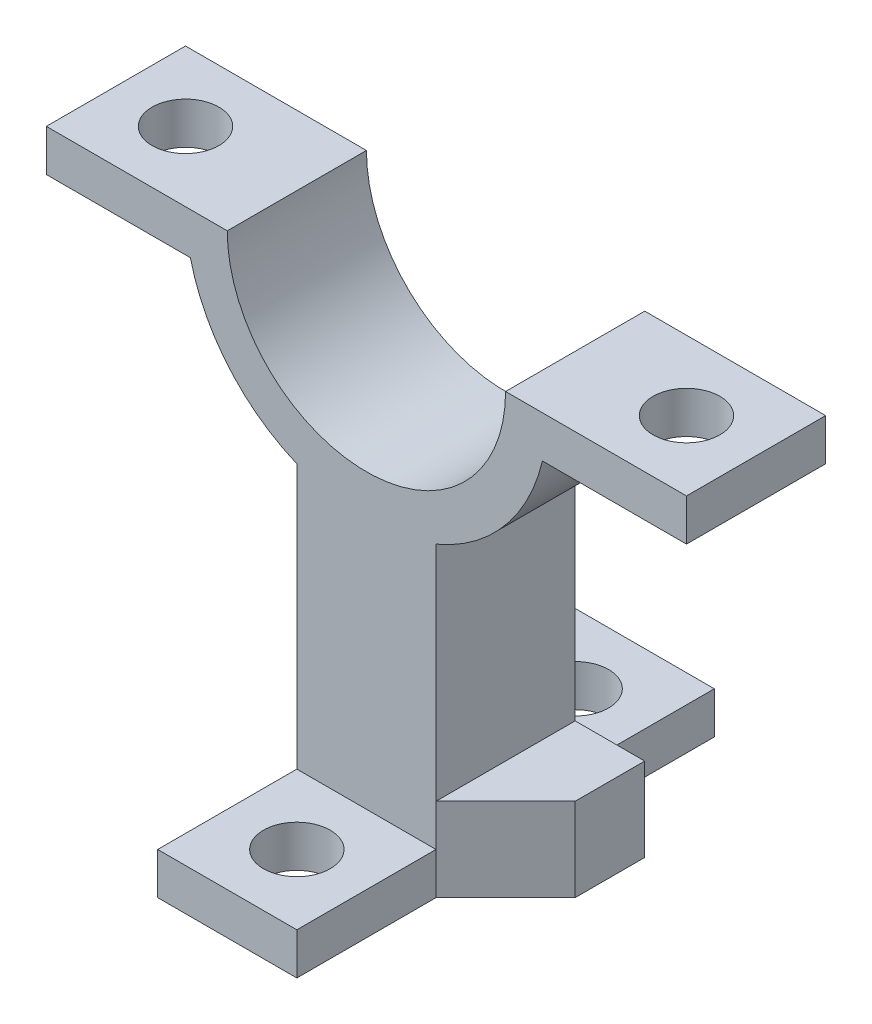
ISO-10303-21;
HEADER;
FILE_DESCRIPTION(('STEP AP214'),'2;1');
FILE_NAME('part.step','',(''),(''),'','','');
FILE_SCHEMA(('AUTOMOTIVE_DESIGN { 1 0 10303 214 1 1 1 1 }'));
ENDSEC;
DATA;
#1=APPLICATION_CONTEXT('core data for automotive mechanical design processes');
#2=APPLICATION_PROTOCOL_DEFINITION('international standard','automotive_design',2000,#1);
#3=PRODUCT_CONTEXT('',#1,'mechanical');
#4=PRODUCT('Part','Part','',(#3));
#5=PRODUCT_RELATED_PRODUCT_CATEGORY('part','',(#4));
#6=PRODUCT_DEFINITION_FORMATION('','',#4);
#7=PRODUCT_DEFINITION_CONTEXT('part definition',#1,'design');
#8=PRODUCT_DEFINITION('design','',#6,#7);
#9=PRODUCT_DEFINITION_SHAPE('','',#8);
#10=(LENGTH_UNIT() NAMED_UNIT(*) SI_UNIT(.MILLI.,.METRE.));
#11=(NAMED_UNIT(*) PLANE_ANGLE_UNIT() SI_UNIT($,.RADIAN.));
#12=(NAMED_UNIT(*) SI_UNIT($,.STERADIAN.) SOLID_ANGLE_UNIT());
#13=UNCERTAINTY_MEASURE_WITH_UNIT(LENGTH_MEASURE(1.E-05),#10,'distance_accuracy_value','');
#14=(GEOMETRIC_REPRESENTATION_CONTEXT(3) GLOBAL_UNCERTAINTY_ASSIGNED_CONTEXT((#13)) GLOBAL_UNIT_ASSIGNED_CONTEXT((#10,
#11,#12)) REPRESENTATION_CONTEXT('',''));
#15=CARTESIAN_POINT('',(0.,0.,0.));
#16=DIRECTION('',(0.,0.,1.));
#17=DIRECTION('',(1.,0.,0.));
#18=AXIS2_PLACEMENT_3D('',#15,#16,#17);
#19=CARTESIAN_POINT('',(-4.99999999999996,-4.15331193145908,2.5));
#20=DIRECTION('',(1.,0.,0.));
#21=DIRECTION('',(0.,1.,0.));
#22=AXIS2_PLACEMENT_3D('',#19,#20,#21);
#23=PLANE('',#22);
#24=DIRECTION('',(0.,0.,-1.));
#25=VECTOR('',#24,1.);
#26=CARTESIAN_POINT('',(-4.99999999999994,-14.,7.5));
#27=LINE('',#26,#25);
#28=CARTESIAN_POINT('',(-4.99999999999994,-14.,0.));
#29=VERTEX_POINT('',#28);
#30=CARTESIAN_POINT('',(-4.99999999999994,-14.,-2.5));
#31=VERTEX_POINT('',#30);
#32=EDGE_CURVE('E491',#29,#31,#27,.T.);
#33=ORIENTED_EDGE('',*,*,#32,.T.);
#34=DIRECTION('',(0.,-1.,0.));
#35=VECTOR('',#34,1.);
#36=CARTESIAN_POINT('',(-4.99999999999996,-4.15331193145908,-2.5));
#37=LINE('',#36,#35);
#38=CARTESIAN_POINT('',(-5.,-17.,-2.5));
#39=VERTEX_POINT('',#38);
#40=EDGE_CURVE('E379',#31,#39,#37,.T.);
#41=ORIENTED_EDGE('',*,*,#40,.T.);
#42=DIRECTION('',(0.,0.,-1.));
#43=VECTOR('',#42,1.);
#44=CARTESIAN_POINT('',(-5.,-17.,2.5));
#45=LINE('',#44,#43);
#46=CARTESIAN_POINT('',(-4.99999999999994,-17.,0.));
#47=VERTEX_POINT('',#46);
#48=EDGE_CURVE('E418',#47,#39,#45,.T.);
#49=ORIENTED_EDGE('',*,*,#48,.F.);
#50=DIRECTION('',(0.,-1.,0.));
#51=VECTOR('',#50,1.);
#52=CARTESIAN_POINT('',(-5.00000000000001,0.00100000000002876,0.));
#53=LINE('',#52,#51);
#54=EDGE_CURVE('E228',#29,#47,#53,.T.);
#55=ORIENTED_EDGE('',*,*,#54,.F.);
#56=EDGE_LOOP('',(#33,#41,#49,#55));
#57=FACE_BOUND('',#56,.T.);
#58=ADVANCED_FACE('F39',(#57),#23,.F.);
#59=CARTESIAN_POINT('',(5.,-4.15331193145904,2.5));
#60=DIRECTION('',(-1.,0.,0.));
#61=DIRECTION('',(0.,-1.,0.));
#62=AXIS2_PLACEMENT_3D('',#59,#60,#61);
#63=PLANE('',#62);
#64=DIRECTION('',(0.,0.,-1.));
#65=VECTOR('',#64,1.);
#66=CARTESIAN_POINT('',(4.99999999999994,-14.,7.5));
#67=LINE('',#66,#65);
#68=CARTESIAN_POINT('',(4.99999999999994,-14.,0.));
#69=VERTEX_POINT('',#68);
#70=CARTESIAN_POINT('',(4.99999999999994,-14.,-2.5));
#71=VERTEX_POINT('',#70);
#72=EDGE_CURVE('E201',#69,#71,#67,.T.);
#73=ORIENTED_EDGE('',*,*,#72,.F.);
#74=DIRECTION('',(0.,-1.,0.));
#75=VECTOR('',#74,1.);
#76=CARTESIAN_POINT('',(4.99999999999986,0.00100000000007039,0.));
#77=LINE('',#76,#75);
#78=CARTESIAN_POINT('',(4.99999999999994,-17.,0.));
#79=VERTEX_POINT('',#78);
#80=EDGE_CURVE('E211',#69,#79,#77,.T.);
#81=ORIENTED_EDGE('',*,*,#80,.T.);
#82=DIRECTION('',(0.,0.,-1.));
#83=VECTOR('',#82,1.);
#84=CARTESIAN_POINT('',(5.,-17.,2.5));
#85=LINE('',#84,#83);
#86=CARTESIAN_POINT('',(5.,-17.,-2.5));
#87=VERTEX_POINT('',#86);
#88=EDGE_CURVE('E415',#79,#87,#85,.T.);
#89=ORIENTED_EDGE('',*,*,#88,.T.);
#90=DIRECTION('',(0.,1.,0.));
#91=VECTOR('',#90,1.);
#92=CARTESIAN_POINT('',(5.,-4.15331193145904,-2.5));
#93=LINE('',#92,#91);
#94=EDGE_CURVE('E214',#87,#71,#93,.T.);
#95=ORIENTED_EDGE('',*,*,#94,.T.);
#96=EDGE_LOOP('',(#73,#81,#89,#95));
#97=FACE_BOUND('',#96,.T.);
#98=ADVANCED_FACE('F210',(#97),#63,.F.);
#99=CARTESIAN_POINT('',(0.,0.,-2.5));
#100=DIRECTION('',(0.,0.,-1.));
#101=DIRECTION('',(-1.,0.,0.));
#102=AXIS2_PLACEMENT_3D('',#99,#100,#101);
#103=PLANE('',#102);
#104=DIRECTION('',(0.,1.,0.));
#105=VECTOR('',#104,1.);
#106=CARTESIAN_POINT('',(-2.50000000000007,0.,-2.5));
#107=LINE('',#106,#105);
#108=CARTESIAN_POINT('',(-2.50000000000001,-14.,-2.5));
#109=VERTEX_POINT('',#108);
#110=CARTESIAN_POINT('',(-2.50000000000005,-5.99999999999998,-2.5));
#111=VERTEX_POINT('',#110);
#112=EDGE_CURVE('E565',#109,#111,#107,.T.);
#113=ORIENTED_EDGE('',*,*,#112,.T.);
#114=CARTESIAN_POINT('',(0.,0.,-2.5));
#115=DIRECTION('',(0.,0.,1.));
#116=DIRECTION('',(-1.,0.,0.));
#117=AXIS2_PLACEMENT_3D('',#114,#115,#116);
#118=CIRCLE('',#117,6.5);
#119=CARTESIAN_POINT('',(-6.32455532033674,-1.50000000000006,-2.5));
#120=VERTEX_POINT('',#119);
#121=EDGE_CURVE('E376',#120,#111,#118,.T.);
#122=ORIENTED_EDGE('',*,*,#121,.F.);
#123=DIRECTION('',(1.,0.,0.));
#124=VECTOR('',#123,1.);
#125=CARTESIAN_POINT('',(-11.5,-1.5000000000001,-2.5));
#126=LINE('',#125,#124);
#127=CARTESIAN_POINT('',(-11.5,-1.5000000000001,-2.5));
#128=VERTEX_POINT('',#127);
#129=EDGE_CURVE('E373',#128,#120,#126,.T.);
#130=ORIENTED_EDGE('',*,*,#129,.F.);
#131=DIRECTION('',(0.,-1.,0.));
#132=VECTOR('',#131,1.);
#133=CARTESIAN_POINT('',(-11.5,-1.03464805829096E-13,-2.5));
#134=LINE('',#133,#132);
#135=CARTESIAN_POINT('',(-11.5,-1.03464805829096E-13,-2.5));
#136=VERTEX_POINT('',#135);
#137=EDGE_CURVE('E370',#136,#128,#134,.T.);
#138=ORIENTED_EDGE('',*,*,#137,.F.);
#139=DIRECTION('',(-1.,0.,0.));
#140=VECTOR('',#139,1.);
#141=CARTESIAN_POINT('',(-5.,0.,-2.5));
#142=LINE('',#141,#140);
#143=CARTESIAN_POINT('',(-5.,0.,-2.5));
#144=VERTEX_POINT('',#143);
#145=EDGE_CURVE('E367',#144,#136,#142,.T.);
#146=ORIENTED_EDGE('',*,*,#145,.F.);
#147=CARTESIAN_POINT('',(0.,0.,-2.5));
#148=DIRECTION('',(0.,0.,-1.));
#149=DIRECTION('',(-1.,0.,0.));
#150=AXIS2_PLACEMENT_3D('',#147,#148,#149);
#151=CIRCLE('',#150,5.);
#152=CARTESIAN_POINT('',(5.,0.,-2.5));
#153=VERTEX_POINT('',#152);
#154=EDGE_CURVE('E363',#153,#144,#151,.T.);
#155=ORIENTED_EDGE('',*,*,#154,.F.);
#156=DIRECTION('',(-1.,0.,0.));
#157=VECTOR('',#156,1.);
#158=CARTESIAN_POINT('',(5.,0.,-2.5));
#159=LINE('',#158,#157);
#160=CARTESIAN_POINT('',(11.5,0.,-2.5));
#161=VERTEX_POINT('',#160);
#162=EDGE_CURVE('E338',#161,#153,#159,.T.);
#163=ORIENTED_EDGE('',*,*,#162,.F.);
#164=DIRECTION('',(0.,1.,0.));
#165=VECTOR('',#164,1.);
#166=CARTESIAN_POINT('',(11.5,0.,-2.5));
#167=LINE('',#166,#165);
#168=CARTESIAN_POINT('',(11.5,-1.5,-2.5));
#169=VERTEX_POINT('',#168);
#170=EDGE_CURVE('E395',#169,#161,#167,.T.);
#171=ORIENTED_EDGE('',*,*,#170,.F.);
#172=DIRECTION('',(1.,0.,0.));
#173=VECTOR('',#172,1.);
#174=CARTESIAN_POINT('',(11.5,-1.5,-2.5));
#175=LINE('',#174,#173);
#176=CARTESIAN_POINT('',(6.32455532033676,-1.5,-2.5));
#177=VERTEX_POINT('',#176);
#178=EDGE_CURVE('E392',#177,#169,#175,.T.);
#179=ORIENTED_EDGE('',*,*,#178,.F.);
#180=CARTESIAN_POINT('',(0.,0.,-2.5));
#181=DIRECTION('',(0.,0.,1.));
#182=DIRECTION('',(1.,0.,0.));
#183=AXIS2_PLACEMENT_3D('',#180,#181,#182);
#184=CIRCLE('',#183,6.5);
#185=CARTESIAN_POINT('',(2.49999999999995,-6.00000000000002,-2.5));
#186=VERTEX_POINT('',#185);
#187=EDGE_CURVE('E389',#186,#177,#184,.T.);
#188=ORIENTED_EDGE('',*,*,#187,.F.);
#189=DIRECTION('',(0.,-1.,0.));
#190=VECTOR('',#189,1.);
#191=CARTESIAN_POINT('',(2.49999999999992,0.,-2.5));
#192=LINE('',#191,#190);
#193=CARTESIAN_POINT('',(2.49999999999999,-14.,-2.5));
#194=VERTEX_POINT('',#193);
#195=EDGE_CURVE('E570',#186,#194,#192,.T.);
#196=ORIENTED_EDGE('',*,*,#195,.T.);
#197=DIRECTION('',(1.,0.,0.));
#198=VECTOR('',#197,1.);
#199=CARTESIAN_POINT('',(0.,-14.,-2.5));
#200=LINE('',#199,#198);
#201=EDGE_CURVE('E575',#194,#71,#200,.T.);
#202=ORIENTED_EDGE('',*,*,#201,.T.);
#203=ORIENTED_EDGE('',*,*,#94,.F.);
#204=DIRECTION('',(1.,0.,0.));
#205=VECTOR('',#204,1.);
#206=CARTESIAN_POINT('',(5.,-17.,-2.5));
#207=LINE('',#206,#205);
#208=CARTESIAN_POINT('',(2.5,-17.,-2.5));
#209=VERTEX_POINT('',#208);
#210=EDGE_CURVE('E382',#209,#87,#207,.T.);
#211=ORIENTED_EDGE('',*,*,#210,.F.);
#212=DIRECTION('',(0.,-1.,0.));
#213=VECTOR('',#212,1.);
#214=CARTESIAN_POINT('',(2.49999999999993,0.,-2.5));
#215=LINE('',#214,#213);
#216=CARTESIAN_POINT('',(2.49999999999999,-15.5,-2.5));
#217=VERTEX_POINT('',#216);
#218=EDGE_CURVE('E207',#217,#209,#215,.T.);
#219=ORIENTED_EDGE('',*,*,#218,.F.);
#220=DIRECTION('',(1.,0.,0.));
#221=VECTOR('',#220,1.);
#222=CARTESIAN_POINT('',(0.,-15.5,-2.5));
#223=LINE('',#222,#221);
#224=CARTESIAN_POINT('',(-2.50000000000001,-15.5,-2.5));
#225=VERTEX_POINT('',#224);
#226=EDGE_CURVE('E438',#225,#217,#223,.T.);
#227=ORIENTED_EDGE('',*,*,#226,.F.);
#228=DIRECTION('',(0.,1.,0.));
#229=VECTOR('',#228,1.);
#230=CARTESIAN_POINT('',(-2.50000000000007,0.,-2.5));
#231=LINE('',#230,#229);
#232=CARTESIAN_POINT('',(-2.5,-17.,-2.5));
#233=VERTEX_POINT('',#232);
#234=EDGE_CURVE('E444',#233,#225,#231,.T.);
#235=ORIENTED_EDGE('',*,*,#234,.F.);
#236=EDGE_CURVE('E383',#39,#233,#207,.T.);
#237=ORIENTED_EDGE('',*,*,#236,.F.);
#238=ORIENTED_EDGE('',*,*,#40,.F.);
#239=DIRECTION('',(1.,0.,0.));
#240=VECTOR('',#239,1.);
#241=CARTESIAN_POINT('',(0.,-14.,-2.5));
#242=LINE('',#241,#240);
#243=EDGE_CURVE('E238',#31,#109,#242,.T.);
#244=ORIENTED_EDGE('',*,*,#243,.T.);
#245=EDGE_LOOP('',(#113,#122,#130,#138,#146,#155,#163,#171,#179,#188,#196,#202,#203,#211,#219,
#227,#235,#237,#238,#244));
#246=FACE_BOUND('',#245,.T.);
#247=ADVANCED_FACE('F459',(#246),#103,.T.);
#248=CARTESIAN_POINT('',(-2.50000000000007,0.00100000000003916,2.5));
#249=DIRECTION('',(0.707106781186548,0.,-0.707106781186547));
#250=DIRECTION('',(-0.707106781186547,0.,-0.707106781186548));
#251=AXIS2_PLACEMENT_3D('',#248,#249,#250);
#252=PLANE('',#251);
#253=DIRECTION('',(0.707106781186547,0.,0.707106781186548));
#254=VECTOR('',#253,1.);
#255=CARTESIAN_POINT('',(-2.50000000000004,-14.,2.49999999999997));
#256=LINE('',#255,#254);
#257=CARTESIAN_POINT('',(-2.50000000000001,-14.,2.5));
#258=VERTEX_POINT('',#257);
#259=EDGE_CURVE('E11',#29,#258,#256,.T.);
#260=ORIENTED_EDGE('',*,*,#259,.F.);
#261=ORIENTED_EDGE('',*,*,#54,.T.);
#262=DIRECTION('',(0.707106781186547,0.,0.707106781186548));
#263=VECTOR('',#262,1.);
#264=CARTESIAN_POINT('',(-2.5,-17.,2.5));
#265=LINE('',#264,#263);
#266=CARTESIAN_POINT('',(-2.5,-17.,2.5));
#267=VERTEX_POINT('',#266);
#268=EDGE_CURVE('E234',#47,#267,#265,.T.);
#269=ORIENTED_EDGE('',*,*,#268,.T.);
#270=DIRECTION('',(0.,1.,0.));
#271=VECTOR('',#270,1.);
#272=CARTESIAN_POINT('',(-2.50000000000007,0.,2.5));
#273=LINE('',#272,#271);
#274=CARTESIAN_POINT('',(-2.50000000000001,-15.5,2.5));
#275=VERTEX_POINT('',#274);
#276=EDGE_CURVE('E313',#267,#275,#273,.T.);
#277=ORIENTED_EDGE('',*,*,#276,.T.);
#278=DIRECTION('',(0.,-1.,0.));
#279=VECTOR('',#278,1.);
#280=CARTESIAN_POINT('',(-2.50000000000007,0.00100000000003916,2.5));
#281=LINE('',#280,#279);
#282=EDGE_CURVE('E237',#258,#275,#281,.T.);
#283=ORIENTED_EDGE('',*,*,#282,.F.);
#284=EDGE_LOOP('',(#260,#261,#269,#277,#283));
#285=FACE_BOUND('',#284,.T.);
#286=ADVANCED_FACE('F592',(#285),#252,.F.);
#287=CARTESIAN_POINT('',(2.49999999999993,0.00100000000005998,2.5));
#288=DIRECTION('',(-0.707106781186548,0.,-0.707106781186547));
#289=DIRECTION('',(-0.707106781186547,0.,0.707106781186548));
#290=AXIS2_PLACEMENT_3D('',#287,#288,#289);
#291=PLANE('',#290);
#292=DIRECTION('',(0.707106781186547,0.,-0.707106781186548));
#293=VECTOR('',#292,1.);
#294=CARTESIAN_POINT('',(2.49999999999996,-14.,2.50000000000003));
#295=LINE('',#294,#293);
#296=CARTESIAN_POINT('',(2.49999999999999,-14.,2.5));
#297=VERTEX_POINT('',#296);
#298=EDGE_CURVE('E48',#297,#69,#295,.T.);
#299=ORIENTED_EDGE('',*,*,#298,.F.);
#300=DIRECTION('',(0.,-1.,0.));
#301=VECTOR('',#300,1.);
#302=CARTESIAN_POINT('',(2.49999999999993,0.00100000000005998,2.5));
#303=LINE('',#302,#301);
#304=CARTESIAN_POINT('',(2.49999999999999,-15.5,2.5));
#305=VERTEX_POINT('',#304);
#306=EDGE_CURVE('E222',#297,#305,#303,.T.);
#307=ORIENTED_EDGE('',*,*,#306,.T.);
#308=DIRECTION('',(0.,-1.,0.));
#309=VECTOR('',#308,1.);
#310=CARTESIAN_POINT('',(2.49999999999993,0.,2.5));
#311=LINE('',#310,#309);
#312=CARTESIAN_POINT('',(2.5,-17.,2.5));
#313=VERTEX_POINT('',#312);
#314=EDGE_CURVE('E317',#305,#313,#311,.T.);
#315=ORIENTED_EDGE('',*,*,#314,.T.);
#316=DIRECTION('',(0.707106781186547,0.,-0.707106781186548));
#317=VECTOR('',#316,1.);
#318=CARTESIAN_POINT('',(2.5,-17.,2.5));
#319=LINE('',#318,#317);
#320=EDGE_CURVE('E219',#313,#79,#319,.T.);
#321=ORIENTED_EDGE('',*,*,#320,.T.);
#322=ORIENTED_EDGE('',*,*,#80,.F.);
#323=EDGE_LOOP('',(#299,#307,#315,#321,#322));
#324=FACE_BOUND('',#323,.T.);
#325=ADVANCED_FACE('F217',(#324),#291,.F.);
#326=CARTESIAN_POINT('',(0.,0.,2.5));
#327=DIRECTION('',(0.,0.,-1.));
#328=DIRECTION('',(-1.,0.,0.));
#329=AXIS2_PLACEMENT_3D('',#326,#327,#328);
#330=CYLINDRICAL_SURFACE('',#329,5.);
#331=ORIENTED_EDGE('',*,*,#154,.T.);
#332=DIRECTION('',(0.,0.,-1.));
#333=VECTOR('',#332,1.);
#334=CARTESIAN_POINT('',(-5.,0.,2.5));
#335=LINE('',#334,#333);
#336=CARTESIAN_POINT('',(-5.,0.,2.5));
#337=VERTEX_POINT('',#336);
#338=EDGE_CURVE('E434',#337,#144,#335,.T.);
#339=ORIENTED_EDGE('',*,*,#338,.F.);
#340=CARTESIAN_POINT('',(0.,0.,2.5));
#341=DIRECTION('',(0.,0.,-1.));
#342=DIRECTION('',(-1.,0.,0.));
#343=AXIS2_PLACEMENT_3D('',#340,#341,#342);
#344=CIRCLE('',#343,5.);
#345=CARTESIAN_POINT('',(5.,0.,2.5));
#346=VERTEX_POINT('',#345);
#347=EDGE_CURVE('E333',#346,#337,#344,.T.);
#348=ORIENTED_EDGE('',*,*,#347,.F.);
#349=DIRECTION('',(0.,0.,-1.));
#350=VECTOR('',#349,1.);
#351=CARTESIAN_POINT('',(5.,0.,2.5));
#352=LINE('',#351,#350);
#353=EDGE_CURVE('E362',#346,#153,#352,.T.);
#354=ORIENTED_EDGE('',*,*,#353,.T.);
#355=EDGE_LOOP('',(#331,#339,#348,#354));
#356=FACE_BOUND('',#355,.T.);
#357=ADVANCED_FACE('F41',(#356),#330,.F.);
#358=CARTESIAN_POINT('',(-5.,0.,2.5));
#359=DIRECTION('',(0.,-1.,0.));
#360=DIRECTION('',(1.,0.,0.));
#361=AXIS2_PLACEMENT_3D('',#358,#359,#360);
#362=PLANE('',#361);
#363=CARTESIAN_POINT('',(-9.,0.,0.));
#364=DIRECTION('',(0.,1.,0.));
#365=DIRECTION('',(0.,0.,1.));
#366=AXIS2_PLACEMENT_3D('',#363,#364,#365);
#367=CIRCLE('',#366,1.2);
#368=CARTESIAN_POINT('',(-9.,0.,1.2));
#369=VERTEX_POINT('',#368);
#370=EDGE_CURVE('E321',#369,#369,#367,.T.);
#371=ORIENTED_EDGE('',*,*,#370,.F.);
#372=EDGE_LOOP('',(#371));
#373=FACE_BOUND('',#372,.T.);
#374=ORIENTED_EDGE('',*,*,#145,.T.);
#375=DIRECTION('',(0.,0.,-1.));
#376=VECTOR('',#375,1.);
#377=CARTESIAN_POINT('',(-11.5,-1.03464805829096E-13,2.5));
#378=LINE('',#377,#376);
#379=CARTESIAN_POINT('',(-11.5,-1.03464805829096E-13,2.5));
#380=VERTEX_POINT('',#379);
#381=EDGE_CURVE('E430',#380,#136,#378,.T.);
#382=ORIENTED_EDGE('',*,*,#381,.F.);
#383=DIRECTION('',(-1.,0.,0.));
#384=VECTOR('',#383,1.);
#385=CARTESIAN_POINT('',(-5.,0.,2.5));
#386=LINE('',#385,#384);
#387=EDGE_CURVE('E337',#337,#380,#386,.T.);
#388=ORIENTED_EDGE('',*,*,#387,.F.);
#389=ORIENTED_EDGE('',*,*,#338,.T.);
#390=EDGE_LOOP('',(#374,#382,#388,#389));
#391=FACE_BOUND('',#390,.T.);
#392=ADVANCED_FACE('F536',(#373,#391),#362,.F.);
#393=CARTESIAN_POINT('',(-11.5,-1.03464805829096E-13,2.5));
#394=DIRECTION('',(1.,0.,0.));
#395=DIRECTION('',(0.,1.,0.));
#396=AXIS2_PLACEMENT_3D('',#393,#394,#395);
#397=PLANE('',#396);
#398=ORIENTED_EDGE('',*,*,#137,.T.);
#399=DIRECTION('',(0.,0.,-1.));
#400=VECTOR('',#399,1.);
#401=CARTESIAN_POINT('',(-11.5,-1.5000000000001,2.5));
#402=LINE('',#401,#400);
#403=CARTESIAN_POINT('',(-11.5,-1.5000000000001,2.5));
#404=VERTEX_POINT('',#403);
#405=EDGE_CURVE('E426',#404,#128,#402,.T.);
#406=ORIENTED_EDGE('',*,*,#405,.F.);
#407=DIRECTION('',(0.,-1.,0.));
#408=VECTOR('',#407,1.);
#409=CARTESIAN_POINT('',(-11.5,-1.03464805829096E-13,2.5));
#410=LINE('',#409,#408);
#411=EDGE_CURVE('E341',#380,#404,#410,.T.);
#412=ORIENTED_EDGE('',*,*,#411,.F.);
#413=ORIENTED_EDGE('',*,*,#381,.T.);
#414=EDGE_LOOP('',(#398,#406,#412,#413));
#415=FACE_BOUND('',#414,.T.);
#416=ADVANCED_FACE('F533',(#415),#397,.F.);
#417=CARTESIAN_POINT('',(-11.5,-1.5000000000001,2.5));
#418=DIRECTION('',(0.,1.,0.));
#419=DIRECTION('',(-1.,0.,0.));
#420=AXIS2_PLACEMENT_3D('',#417,#418,#419);
#421=PLANE('',#420);
#422=CARTESIAN_POINT('',(-9.,-1.50000000000008,0.));
#423=DIRECTION('',(0.,1.,0.));
#424=DIRECTION('',(-1.,0.,0.));
#425=AXIS2_PLACEMENT_3D('',#422,#423,#424);
#426=CIRCLE('',#425,1.2);
#427=CARTESIAN_POINT('',(-10.2,-1.50000000000009,0.));
#428=VERTEX_POINT('',#427);
#429=EDGE_CURVE('E332',#428,#428,#426,.T.);
#430=ORIENTED_EDGE('',*,*,#429,.T.);
#431=EDGE_LOOP('',(#430));
#432=FACE_BOUND('',#431,.T.);
#433=ORIENTED_EDGE('',*,*,#129,.T.);
#434=DIRECTION('',(0.,0.,-1.));
#435=VECTOR('',#434,1.);
#436=CARTESIAN_POINT('',(-6.32455532033674,-1.50000000000006,2.5));
#437=LINE('',#436,#435);
#438=CARTESIAN_POINT('',(-6.32455532033674,-1.50000000000006,2.5));
#439=VERTEX_POINT('',#438);
#440=EDGE_CURVE('E422',#439,#120,#437,.T.);
#441=ORIENTED_EDGE('',*,*,#440,.F.);
#442=DIRECTION('',(1.,0.,0.));
#443=VECTOR('',#442,1.);
#444=CARTESIAN_POINT('',(-11.5,-1.5000000000001,2.5));
#445=LINE('',#444,#443);
#446=EDGE_CURVE('E344',#404,#439,#445,.T.);
#447=ORIENTED_EDGE('',*,*,#446,.F.);
#448=ORIENTED_EDGE('',*,*,#405,.T.);
#449=EDGE_LOOP('',(#433,#441,#447,#448));
#450=FACE_BOUND('',#449,.T.);
#451=ADVANCED_FACE('F529',(#432,#450),#421,.F.);
#452=CARTESIAN_POINT('',(0.,0.,2.5));
#453=DIRECTION('',(0.,0.,-1.));
#454=DIRECTION('',(-1.,0.,0.));
#455=AXIS2_PLACEMENT_3D('',#452,#453,#454);
#456=CYLINDRICAL_SURFACE('',#455,6.5);
#457=DIRECTION('',(0.,0.,-1.));
#458=VECTOR('',#457,1.);
#459=CARTESIAN_POINT('',(-2.50000000000005,-5.99999999999998,7.5));
#460=LINE('',#459,#458);
#461=CARTESIAN_POINT('',(-2.50000000000005,-5.99999999999998,2.50000000000001));
#462=VERTEX_POINT('',#461);
#463=EDGE_CURVE('E560',#462,#111,#460,.T.);
#464=ORIENTED_EDGE('',*,*,#463,.F.);
#465=CARTESIAN_POINT('',(0.,0.,2.5));
#466=DIRECTION('',(0.,0.,1.));
#467=DIRECTION('',(-1.,0.,0.));
#468=AXIS2_PLACEMENT_3D('',#465,#466,#467);
#469=CIRCLE('',#468,6.5);
#470=EDGE_CURVE('E347',#439,#462,#469,.T.);
#471=ORIENTED_EDGE('',*,*,#470,.F.);
#472=ORIENTED_EDGE('',*,*,#440,.T.);
#473=ORIENTED_EDGE('',*,*,#121,.T.);
#474=EDGE_LOOP('',(#464,#471,#472,#473));
#475=FACE_BOUND('',#474,.T.);
#476=ADVANCED_FACE('F526',(#475),#456,.T.);
#477=CARTESIAN_POINT('',(5.,-17.,2.5));
#478=DIRECTION('',(0.,1.,0.));
#479=DIRECTION('',(0.,0.,1.));
#480=AXIS2_PLACEMENT_3D('',#477,#478,#479);
#481=PLANE('',#480);
#482=ORIENTED_EDGE('',*,*,#88,.F.);
#483=ORIENTED_EDGE('',*,*,#320,.F.);
#484=DIRECTION('',(0.,0.,1.));
#485=VECTOR('',#484,1.);
#486=CARTESIAN_POINT('',(2.5,-17.,-7.5));
#487=LINE('',#486,#485);
#488=CARTESIAN_POINT('',(2.5,-17.,7.5));
#489=VERTEX_POINT('',#488);
#490=EDGE_CURVE('E257',#313,#489,#487,.T.);
#491=ORIENTED_EDGE('',*,*,#490,.T.);
#492=DIRECTION('',(-1.,0.,0.));
#493=VECTOR('',#492,1.);
#494=CARTESIAN_POINT('',(-2.5,-17.,7.5));
#495=LINE('',#494,#493);
#496=CARTESIAN_POINT('',(-2.5,-17.,7.5));
#497=VERTEX_POINT('',#496);
#498=EDGE_CURVE('E283',#489,#497,#495,.T.);
#499=ORIENTED_EDGE('',*,*,#498,.T.);
#500=DIRECTION('',(0.,0.,-1.));
#501=VECTOR('',#500,1.);
#502=CARTESIAN_POINT('',(-2.5,-17.,-7.5));
#503=LINE('',#502,#501);
#504=EDGE_CURVE('E288',#497,#267,#503,.T.);
#505=ORIENTED_EDGE('',*,*,#504,.T.);
#506=ORIENTED_EDGE('',*,*,#268,.F.);
#507=ORIENTED_EDGE('',*,*,#48,.T.);
#508=ORIENTED_EDGE('',*,*,#236,.T.);
#509=CARTESIAN_POINT('',(-2.5,-17.,-7.5));
#510=VERTEX_POINT('',#509);
#511=EDGE_CURVE('E287',#233,#510,#503,.T.);
#512=ORIENTED_EDGE('',*,*,#511,.T.);
#513=DIRECTION('',(1.,0.,0.));
#514=VECTOR('',#513,1.);
#515=CARTESIAN_POINT('',(-2.5,-17.,-7.5));
#516=LINE('',#515,#514);
#517=CARTESIAN_POINT('',(2.5,-17.,-7.5));
#518=VERTEX_POINT('',#517);
#519=EDGE_CURVE('E292',#510,#518,#516,.T.);
#520=ORIENTED_EDGE('',*,*,#519,.T.);
#521=EDGE_CURVE('E280',#518,#209,#487,.T.);
#522=ORIENTED_EDGE('',*,*,#521,.T.);
#523=ORIENTED_EDGE('',*,*,#210,.T.);
#524=EDGE_LOOP('',(#482,#483,#491,#499,#505,#506,#507,#508,#512,#520,#522,#523));
#525=FACE_BOUND('',#524,.T.);
#526=CARTESIAN_POINT('',(0.,-17.,-5.));
#527=DIRECTION('',(0.,-1.,0.));
#528=DIRECTION('',(-1.,0.,0.));
#529=AXIS2_PLACEMENT_3D('',#526,#527,#528);
#530=CIRCLE('',#529,1.2);
#531=CARTESIAN_POINT('',(-1.2,-17.,-5.));
#532=VERTEX_POINT('',#531);
#533=EDGE_CURVE('E233',#532,#532,#530,.T.);
#534=ORIENTED_EDGE('',*,*,#533,.F.);
#535=EDGE_LOOP('',(#534));
#536=FACE_BOUND('',#535,.T.);
#537=CARTESIAN_POINT('',(0.,-17.,5.));
#538=DIRECTION('',(0.,-1.,0.));
#539=DIRECTION('',(1.,0.,0.));
#540=AXIS2_PLACEMENT_3D('',#537,#538,#539);
#541=CIRCLE('',#540,1.2);
#542=CARTESIAN_POINT('',(1.2,-17.,5.));
#543=VERTEX_POINT('',#542);
#544=EDGE_CURVE('E249',#543,#543,#541,.T.);
#545=ORIENTED_EDGE('',*,*,#544,.F.);
#546=EDGE_LOOP('',(#545));
#547=FACE_BOUND('',#546,.T.);
#548=ADVANCED_FACE('F467',(#525,#536,#547),#481,.F.);
#549=CARTESIAN_POINT('',(0.,0.,2.5));
#550=DIRECTION('',(0.,0.,-1.));
#551=DIRECTION('',(-1.,0.,0.));
#552=AXIS2_PLACEMENT_3D('',#549,#550,#551);
#553=CYLINDRICAL_SURFACE('',#552,6.5);
#554=DIRECTION('',(0.,0.,-1.));
#555=VECTOR('',#554,1.);
#556=CARTESIAN_POINT('',(2.49999999999995,-6.00000000000002,7.5));
#557=LINE('',#556,#555);
#558=CARTESIAN_POINT('',(2.49999999999995,-6.00000000000002,2.49999999999999));
#559=VERTEX_POINT('',#558);
#560=EDGE_CURVE('E567',#559,#186,#557,.T.);
#561=ORIENTED_EDGE('',*,*,#560,.T.);
#562=ORIENTED_EDGE('',*,*,#187,.T.);
#563=DIRECTION('',(0.,0.,-1.));
#564=VECTOR('',#563,1.);
#565=CARTESIAN_POINT('',(6.32455532033676,-1.5,2.5));
#566=LINE('',#565,#564);
#567=CARTESIAN_POINT('',(6.32455532033676,-1.5,2.5));
#568=VERTEX_POINT('',#567);
#569=EDGE_CURVE('E411',#568,#177,#566,.T.);
#570=ORIENTED_EDGE('',*,*,#569,.F.);
#571=CARTESIAN_POINT('',(0.,0.,2.5));
#572=DIRECTION('',(0.,0.,1.));
#573=DIRECTION('',(1.,0.,0.));
#574=AXIS2_PLACEMENT_3D('',#571,#572,#573);
#575=CIRCLE('',#574,6.5);
#576=EDGE_CURVE('E350',#559,#568,#575,.T.);
#577=ORIENTED_EDGE('',*,*,#576,.F.);
#578=EDGE_LOOP('',(#561,#562,#570,#577));
#579=FACE_BOUND('',#578,.T.);
#580=ADVANCED_FACE('F602',(#579),#553,.T.);
#581=CARTESIAN_POINT('',(11.5,-1.5,2.5));
#582=DIRECTION('',(0.,1.,0.));
#583=DIRECTION('',(-1.,0.,0.));
#584=AXIS2_PLACEMENT_3D('',#581,#582,#583);
#585=PLANE('',#584);
#586=CARTESIAN_POINT('',(9.,-1.5,0.));
#587=DIRECTION('',(0.,1.,0.));
#588=DIRECTION('',(-1.,0.,0.));
#589=AXIS2_PLACEMENT_3D('',#586,#587,#588);
#590=CIRCLE('',#589,1.2);
#591=CARTESIAN_POINT('',(7.8,-1.5,0.));
#592=VERTEX_POINT('',#591);
#593=EDGE_CURVE('E325',#592,#592,#590,.T.);
#594=ORIENTED_EDGE('',*,*,#593,.T.);
#595=EDGE_LOOP('',(#594));
#596=FACE_BOUND('',#595,.T.);
#597=ORIENTED_EDGE('',*,*,#178,.T.);
#598=DIRECTION('',(0.,0.,-1.));
#599=VECTOR('',#598,1.);
#600=CARTESIAN_POINT('',(11.5,-1.5,2.5));
#601=LINE('',#600,#599);
#602=CARTESIAN_POINT('',(11.5,-1.5,2.5));
#603=VERTEX_POINT('',#602);
#604=EDGE_CURVE('E407',#603,#169,#601,.T.);
#605=ORIENTED_EDGE('',*,*,#604,.F.);
#606=DIRECTION('',(1.,0.,0.));
#607=VECTOR('',#606,1.);
#608=CARTESIAN_POINT('',(11.5,-1.5,2.5));
#609=LINE('',#608,#607);
#610=EDGE_CURVE('E353',#568,#603,#609,.T.);
#611=ORIENTED_EDGE('',*,*,#610,.F.);
#612=ORIENTED_EDGE('',*,*,#569,.T.);
#613=EDGE_LOOP('',(#597,#605,#611,#612));
#614=FACE_BOUND('',#613,.T.);
#615=ADVANCED_FACE('F607',(#596,#614),#585,.F.);
#616=CARTESIAN_POINT('',(11.5,0.,2.5));
#617=DIRECTION('',(-1.,0.,0.));
#618=DIRECTION('',(0.,0.,1.));
#619=AXIS2_PLACEMENT_3D('',#616,#617,#618);
#620=PLANE('',#619);
#621=ORIENTED_EDGE('',*,*,#170,.T.);
#622=DIRECTION('',(0.,0.,-1.));
#623=VECTOR('',#622,1.);
#624=CARTESIAN_POINT('',(11.5,0.,2.5));
#625=LINE('',#624,#623);
#626=CARTESIAN_POINT('',(11.5,0.,2.5));
#627=VERTEX_POINT('',#626);
#628=EDGE_CURVE('E403',#627,#161,#625,.T.);
#629=ORIENTED_EDGE('',*,*,#628,.F.);
#630=DIRECTION('',(0.,1.,0.));
#631=VECTOR('',#630,1.);
#632=CARTESIAN_POINT('',(11.5,0.,2.5));
#633=LINE('',#632,#631);
#634=EDGE_CURVE('E356',#603,#627,#633,.T.);
#635=ORIENTED_EDGE('',*,*,#634,.F.);
#636=ORIENTED_EDGE('',*,*,#604,.T.);
#637=EDGE_LOOP('',(#621,#629,#635,#636));
#638=FACE_BOUND('',#637,.T.);
#639=ADVANCED_FACE('F613',(#638),#620,.F.);
#640=CARTESIAN_POINT('',(5.,0.,2.5));
#641=DIRECTION('',(0.,-1.,0.));
#642=DIRECTION('',(1.,0.,0.));
#643=AXIS2_PLACEMENT_3D('',#640,#641,#642);
#644=PLANE('',#643);
#645=CARTESIAN_POINT('',(9.,0.,0.));
#646=DIRECTION('',(0.,1.,0.));
#647=DIRECTION('',(0.,0.,-1.));
#648=AXIS2_PLACEMENT_3D('',#645,#646,#647);
#649=CIRCLE('',#648,1.2);
#650=CARTESIAN_POINT('',(9.,0.,-1.2));
#651=VERTEX_POINT('',#650);
#652=EDGE_CURVE('E320',#651,#651,#649,.T.);
#653=ORIENTED_EDGE('',*,*,#652,.F.);
#654=EDGE_LOOP('',(#653));
#655=FACE_BOUND('',#654,.T.);
#656=ORIENTED_EDGE('',*,*,#162,.T.);
#657=ORIENTED_EDGE('',*,*,#353,.F.);
#658=DIRECTION('',(-1.,0.,0.));
#659=VECTOR('',#658,1.);
#660=CARTESIAN_POINT('',(5.,0.,2.5));
#661=LINE('',#660,#659);
#662=EDGE_CURVE('E359',#627,#346,#661,.T.);
#663=ORIENTED_EDGE('',*,*,#662,.F.);
#664=ORIENTED_EDGE('',*,*,#628,.T.);
#665=EDGE_LOOP('',(#656,#657,#663,#664));
#666=FACE_BOUND('',#665,.T.);
#667=ADVANCED_FACE('F617',(#655,#666),#644,.F.);
#668=CARTESIAN_POINT('',(0.,0.,2.5));
#669=DIRECTION('',(0.,0.,-1.));
#670=DIRECTION('',(-1.,0.,0.));
#671=AXIS2_PLACEMENT_3D('',#668,#669,#670);
#672=PLANE('',#671);
#673=EDGE_CURVE('E226',#559,#297,#303,.T.);
#674=ORIENTED_EDGE('',*,*,#673,.F.);
#675=ORIENTED_EDGE('',*,*,#576,.T.);
#676=ORIENTED_EDGE('',*,*,#610,.T.);
#677=ORIENTED_EDGE('',*,*,#634,.T.);
#678=ORIENTED_EDGE('',*,*,#662,.T.);
#679=ORIENTED_EDGE('',*,*,#347,.T.);
#680=ORIENTED_EDGE('',*,*,#387,.T.);
#681=ORIENTED_EDGE('',*,*,#411,.T.);
#682=ORIENTED_EDGE('',*,*,#446,.T.);
#683=ORIENTED_EDGE('',*,*,#470,.T.);
#684=EDGE_CURVE('E239',#462,#258,#281,.T.);
#685=ORIENTED_EDGE('',*,*,#684,.T.);
#686=ORIENTED_EDGE('',*,*,#282,.T.);
#687=DIRECTION('',(1.,0.,0.));
#688=VECTOR('',#687,1.);
#689=CARTESIAN_POINT('',(0.,-15.5,2.5));
#690=LINE('',#689,#688);
#691=EDGE_CURVE('E299',#275,#305,#690,.T.);
#692=ORIENTED_EDGE('',*,*,#691,.T.);
#693=ORIENTED_EDGE('',*,*,#306,.F.);
#694=EDGE_LOOP('',(#674,#675,#676,#677,#678,#679,#680,#681,#682,#683,#685,#686,#692,#693));
#695=FACE_BOUND('',#694,.T.);
#696=ADVANCED_FACE('F563',(#695),#672,.F.);
#697=CARTESIAN_POINT('',(9.,-17.,0.));
#698=DIRECTION('',(0.,1.,0.));
#699=DIRECTION('',(0.,0.,1.));
#700=AXIS2_PLACEMENT_3D('',#697,#698,#699);
#701=CYLINDRICAL_SURFACE('',#700,1.2);
#702=ORIENTED_EDGE('',*,*,#652,.T.);
#703=EDGE_LOOP('',(#702));
#704=FACE_BOUND('',#703,.T.);
#705=ORIENTED_EDGE('',*,*,#593,.F.);
#706=EDGE_LOOP('',(#705));
#707=FACE_BOUND('',#706,.T.);
#708=ADVANCED_FACE('F626',(#704,#707),#701,.F.);
#709=CARTESIAN_POINT('',(-9.,-17.,0.));
#710=DIRECTION('',(0.,1.,0.));
#711=DIRECTION('',(0.,0.,1.));
#712=AXIS2_PLACEMENT_3D('',#709,#710,#711);
#713=CYLINDRICAL_SURFACE('',#712,1.2);
#714=ORIENTED_EDGE('',*,*,#370,.T.);
#715=EDGE_LOOP('',(#714));
#716=FACE_BOUND('',#715,.T.);
#717=ORIENTED_EDGE('',*,*,#429,.F.);
#718=EDGE_LOOP('',(#717));
#719=FACE_BOUND('',#718,.T.);
#720=ADVANCED_FACE('F692',(#716,#719),#713,.F.);
#721=CARTESIAN_POINT('',(0.,-15.5,-5.));
#722=DIRECTION('',(0.,-1.,0.));
#723=DIRECTION('',(1.,0.,0.));
#724=AXIS2_PLACEMENT_3D('',#721,#722,#723);
#725=CYLINDRICAL_SURFACE('',#724,1.2);
#726=CARTESIAN_POINT('',(0.,-15.5,-5.));
#727=DIRECTION('',(0.,-1.,0.));
#728=DIRECTION('',(-1.,0.,0.));
#729=AXIS2_PLACEMENT_3D('',#726,#727,#728);
#730=CIRCLE('',#729,1.2);
#731=CARTESIAN_POINT('',(-1.20000000000001,-15.5,-5.));
#732=VERTEX_POINT('',#731);
#733=EDGE_CURVE('E245',#732,#732,#730,.T.);
#734=ORIENTED_EDGE('',*,*,#733,.F.);
#735=EDGE_LOOP('',(#734));
#736=FACE_BOUND('',#735,.T.);
#737=ORIENTED_EDGE('',*,*,#533,.T.);
#738=EDGE_LOOP('',(#737));
#739=FACE_BOUND('',#738,.T.);
#740=ADVANCED_FACE('F513',(#736,#739),#725,.F.);
#741=CARTESIAN_POINT('',(-2.50000000000001,-15.5,-7.5));
#742=DIRECTION('',(0.,0.,-1.));
#743=DIRECTION('',(-1.,0.,0.));
#744=AXIS2_PLACEMENT_3D('',#741,#742,#743);
#745=PLANE('',#744);
#746=ORIENTED_EDGE('',*,*,#519,.F.);
#747=DIRECTION('',(0.,-1.,0.));
#748=VECTOR('',#747,1.);
#749=CARTESIAN_POINT('',(-2.50000000000001,-15.5,-7.5));
#750=LINE('',#749,#748);
#751=CARTESIAN_POINT('',(-2.50000000000001,-15.5,-7.5));
#752=VERTEX_POINT('',#751);
#753=EDGE_CURVE('E300',#752,#510,#750,.T.);
#754=ORIENTED_EDGE('',*,*,#753,.F.);
#755=DIRECTION('',(1.,0.,0.));
#756=VECTOR('',#755,1.);
#757=CARTESIAN_POINT('',(-2.50000000000001,-15.5,-7.5));
#758=LINE('',#757,#756);
#759=CARTESIAN_POINT('',(2.49999999999999,-15.5,-7.5));
#760=VERTEX_POINT('',#759);
#761=EDGE_CURVE('E275',#752,#760,#758,.T.);
#762=ORIENTED_EDGE('',*,*,#761,.T.);
#763=DIRECTION('',(0.,-1.,0.));
#764=VECTOR('',#763,1.);
#765=CARTESIAN_POINT('',(2.49999999999999,-15.5,-7.5));
#766=LINE('',#765,#764);
#767=EDGE_CURVE('E296',#760,#518,#766,.T.);
#768=ORIENTED_EDGE('',*,*,#767,.T.);
#769=EDGE_LOOP('',(#746,#754,#762,#768));
#770=FACE_BOUND('',#769,.T.);
#771=ADVANCED_FACE('F501',(#770),#745,.T.);
#772=CARTESIAN_POINT('',(0.,-15.5,0.));
#773=DIRECTION('',(0.,1.,0.));
#774=DIRECTION('',(-1.,0.,0.));
#775=AXIS2_PLACEMENT_3D('',#772,#773,#774);
#776=PLANE('',#775);
#777=ORIENTED_EDGE('',*,*,#733,.T.);
#778=EDGE_LOOP('',(#777));
#779=FACE_BOUND('',#778,.T.);
#780=DIRECTION('',(0.,0.,-1.));
#781=VECTOR('',#780,1.);
#782=CARTESIAN_POINT('',(-2.50000000000001,-15.5,-7.5));
#783=LINE('',#782,#781);
#784=EDGE_CURVE('E270',#225,#752,#783,.T.);
#785=ORIENTED_EDGE('',*,*,#784,.F.);
#786=ORIENTED_EDGE('',*,*,#226,.T.);
#787=DIRECTION('',(0.,0.,1.));
#788=VECTOR('',#787,1.);
#789=CARTESIAN_POINT('',(2.49999999999999,-15.5,-7.5));
#790=LINE('',#789,#788);
#791=EDGE_CURVE('E261',#760,#217,#790,.T.);
#792=ORIENTED_EDGE('',*,*,#791,.F.);
#793=ORIENTED_EDGE('',*,*,#761,.F.);
#794=EDGE_LOOP('',(#785,#786,#792,#793));
#795=FACE_BOUND('',#794,.T.);
#796=ADVANCED_FACE('F503',(#779,#795),#776,.T.);
#797=CARTESIAN_POINT('',(-2.50000000000001,-15.5,-7.5));
#798=DIRECTION('',(-1.,0.,0.));
#799=DIRECTION('',(0.,-1.,0.));
#800=AXIS2_PLACEMENT_3D('',#797,#798,#799);
#801=PLANE('',#800);
#802=ORIENTED_EDGE('',*,*,#511,.F.);
#803=ORIENTED_EDGE('',*,*,#234,.T.);
#804=ORIENTED_EDGE('',*,*,#784,.T.);
#805=ORIENTED_EDGE('',*,*,#753,.T.);
#806=EDGE_LOOP('',(#802,#803,#804,#805));
#807=FACE_BOUND('',#806,.T.);
#808=ADVANCED_FACE('F497',(#807),#801,.T.);
#809=CARTESIAN_POINT('',(2.49999999999999,-15.5,-7.5));
#810=DIRECTION('',(1.,0.,0.));
#811=DIRECTION('',(0.,1.,0.));
#812=AXIS2_PLACEMENT_3D('',#809,#810,#811);
#813=PLANE('',#812);
#814=ORIENTED_EDGE('',*,*,#791,.T.);
#815=ORIENTED_EDGE('',*,*,#218,.T.);
#816=ORIENTED_EDGE('',*,*,#521,.F.);
#817=ORIENTED_EDGE('',*,*,#767,.F.);
#818=EDGE_LOOP('',(#814,#815,#816,#817));
#819=FACE_BOUND('',#818,.T.);
#820=ADVANCED_FACE('F453',(#819),#813,.T.);
#821=ORIENTED_EDGE('',*,*,#314,.F.);
#822=CARTESIAN_POINT('',(2.49999999999999,-15.5,7.5));
#823=VERTEX_POINT('',#822);
#824=EDGE_CURVE('E266',#305,#823,#790,.T.);
#825=ORIENTED_EDGE('',*,*,#824,.T.);
#826=DIRECTION('',(0.,-1.,0.));
#827=VECTOR('',#826,1.);
#828=CARTESIAN_POINT('',(2.49999999999999,-15.5,7.5));
#829=LINE('',#828,#827);
#830=EDGE_CURVE('E279',#823,#489,#829,.T.);
#831=ORIENTED_EDGE('',*,*,#830,.T.);
#832=ORIENTED_EDGE('',*,*,#490,.F.);
#833=EDGE_LOOP('',(#821,#825,#831,#832));
#834=FACE_BOUND('',#833,.T.);
#835=ADVANCED_FACE('F473',(#834),#813,.T.);
#836=ORIENTED_EDGE('',*,*,#276,.F.);
#837=ORIENTED_EDGE('',*,*,#504,.F.);
#838=DIRECTION('',(0.,-1.,0.));
#839=VECTOR('',#838,1.);
#840=CARTESIAN_POINT('',(-2.50000000000001,-15.5,7.5));
#841=LINE('',#840,#839);
#842=CARTESIAN_POINT('',(-2.50000000000001,-15.5,7.5));
#843=VERTEX_POINT('',#842);
#844=EDGE_CURVE('E304',#843,#497,#841,.T.);
#845=ORIENTED_EDGE('',*,*,#844,.F.);
#846=EDGE_CURVE('E271',#843,#275,#783,.T.);
#847=ORIENTED_EDGE('',*,*,#846,.T.);
#848=EDGE_LOOP('',(#836,#837,#845,#847));
#849=FACE_BOUND('',#848,.T.);
#850=ADVANCED_FACE('F482',(#849),#801,.T.);
#851=CARTESIAN_POINT('',(0.,-15.5,5.));
#852=DIRECTION('',(0.,-1.,0.));
#853=DIRECTION('',(1.,0.,0.));
#854=AXIS2_PLACEMENT_3D('',#851,#852,#853);
#855=CIRCLE('',#854,1.2);
#856=CARTESIAN_POINT('',(1.19999999999999,-15.5,5.));
#857=VERTEX_POINT('',#856);
#858=EDGE_CURVE('E253',#857,#857,#855,.T.);
#859=ORIENTED_EDGE('',*,*,#858,.T.);
#860=EDGE_LOOP('',(#859));
#861=FACE_BOUND('',#860,.T.);
#862=ORIENTED_EDGE('',*,*,#691,.F.);
#863=ORIENTED_EDGE('',*,*,#846,.F.);
#864=DIRECTION('',(-1.,0.,0.));
#865=VECTOR('',#864,1.);
#866=CARTESIAN_POINT('',(-2.50000000000001,-15.5,7.5));
#867=LINE('',#866,#865);
#868=EDGE_CURVE('E265',#823,#843,#867,.T.);
#869=ORIENTED_EDGE('',*,*,#868,.F.);
#870=ORIENTED_EDGE('',*,*,#824,.F.);
#871=EDGE_LOOP('',(#862,#863,#869,#870));
#872=FACE_BOUND('',#871,.T.);
#873=ADVANCED_FACE('F507',(#861,#872),#776,.T.);
#874=CARTESIAN_POINT('',(-2.50000000000001,-15.5,7.5));
#875=DIRECTION('',(0.,0.,1.));
#876=DIRECTION('',(1.,0.,0.));
#877=AXIS2_PLACEMENT_3D('',#874,#875,#876);
#878=PLANE('',#877);
#879=ORIENTED_EDGE('',*,*,#498,.F.);
#880=ORIENTED_EDGE('',*,*,#830,.F.);
#881=ORIENTED_EDGE('',*,*,#868,.T.);
#882=ORIENTED_EDGE('',*,*,#844,.T.);
#883=EDGE_LOOP('',(#879,#880,#881,#882));
#884=FACE_BOUND('',#883,.T.);
#885=ADVANCED_FACE('F477',(#884),#878,.T.);
#886=CARTESIAN_POINT('',(0.,-15.5,5.));
#887=DIRECTION('',(0.,-1.,0.));
#888=DIRECTION('',(1.,0.,0.));
#889=AXIS2_PLACEMENT_3D('',#886,#887,#888);
#890=CYLINDRICAL_SURFACE('',#889,1.2);
#891=ORIENTED_EDGE('',*,*,#858,.F.);
#892=EDGE_LOOP('',(#891));
#893=FACE_BOUND('',#892,.T.);
#894=ORIENTED_EDGE('',*,*,#544,.T.);
#895=EDGE_LOOP('',(#894));
#896=FACE_BOUND('',#895,.T.);
#897=ADVANCED_FACE('F745',(#893,#896),#890,.F.);
#898=CARTESIAN_POINT('',(2.49999999999995,-6.00000000000002,7.5));
#899=DIRECTION('',(1.,0.,0.));
#900=DIRECTION('',(0.,1.,0.));
#901=AXIS2_PLACEMENT_3D('',#898,#899,#900);
#902=PLANE('',#901);
#903=ORIENTED_EDGE('',*,*,#560,.F.);
#904=ORIENTED_EDGE('',*,*,#673,.T.);
#905=DIRECTION('',(0.,0.,-1.));
#906=VECTOR('',#905,1.);
#907=CARTESIAN_POINT('',(2.49999999999999,-14.,7.5));
#908=LINE('',#907,#906);
#909=EDGE_CURVE('E62',#297,#194,#908,.T.);
#910=ORIENTED_EDGE('',*,*,#909,.T.);
#911=ORIENTED_EDGE('',*,*,#195,.F.);
#912=EDGE_LOOP('',(#903,#904,#910,#911));
#913=FACE_BOUND('',#912,.T.);
#914=ADVANCED_FACE('F599',(#913),#902,.T.);
#915=CARTESIAN_POINT('',(2.49999999999999,-14.,7.5));
#916=DIRECTION('',(0.,1.,0.));
#917=DIRECTION('',(0.,0.,1.));
#918=AXIS2_PLACEMENT_3D('',#915,#916,#917);
#919=PLANE('',#918);
#920=ORIENTED_EDGE('',*,*,#909,.F.);
#921=ORIENTED_EDGE('',*,*,#298,.T.);
#922=ORIENTED_EDGE('',*,*,#72,.T.);
#923=ORIENTED_EDGE('',*,*,#201,.F.);
#924=EDGE_LOOP('',(#920,#921,#922,#923));
#925=FACE_BOUND('',#924,.T.);
#926=ADVANCED_FACE('F200',(#925),#919,.T.);
#927=CARTESIAN_POINT('',(-2.50000000000001,-14.,7.5));
#928=DIRECTION('',(0.,1.,0.));
#929=DIRECTION('',(0.,0.,1.));
#930=AXIS2_PLACEMENT_3D('',#927,#928,#929);
#931=PLANE('',#930);
#932=ORIENTED_EDGE('',*,*,#32,.F.);
#933=ORIENTED_EDGE('',*,*,#259,.T.);
#934=DIRECTION('',(0.,0.,-1.));
#935=VECTOR('',#934,1.);
#936=CARTESIAN_POINT('',(-2.50000000000001,-14.,7.5));
#937=LINE('',#936,#935);
#938=EDGE_CURVE('E55',#258,#109,#937,.T.);
#939=ORIENTED_EDGE('',*,*,#938,.T.);
#940=ORIENTED_EDGE('',*,*,#243,.F.);
#941=EDGE_LOOP('',(#932,#933,#939,#940));
#942=FACE_BOUND('',#941,.T.);
#943=ADVANCED_FACE('F589',(#942),#931,.T.);
#944=CARTESIAN_POINT('',(-2.50000000000005,-5.99999999999998,7.5));
#945=DIRECTION('',(-1.,0.,0.));
#946=DIRECTION('',(0.,-1.,0.));
#947=AXIS2_PLACEMENT_3D('',#944,#945,#946);
#948=PLANE('',#947);
#949=ORIENTED_EDGE('',*,*,#938,.F.);
#950=ORIENTED_EDGE('',*,*,#684,.F.);
#951=ORIENTED_EDGE('',*,*,#463,.T.);
#952=ORIENTED_EDGE('',*,*,#112,.F.);
#953=EDGE_LOOP('',(#949,#950,#951,#952));
#954=FACE_BOUND('',#953,.T.);
#955=ADVANCED_FACE('F564',(#954),#948,.T.);
#956=CLOSED_SHELL('',(#58,#98,#247,#286,#325,#357,#392,#416,#451,#476,#548,#580,#615,#639,#667,
#696,#708,#720,#740,#771,#796,#808,#820,#835,#850,#873,#885,#897,#914,#926,#943,#955));
#957=MANIFOLD_SOLID_BREP('B2',#956);
#958=ADVANCED_BREP_SHAPE_REPRESENTATION('',(#18,#957),#14);
#959=SHAPE_DEFINITION_REPRESENTATION(#9,#958);
ENDSEC;
END-ISO-10303-21;
